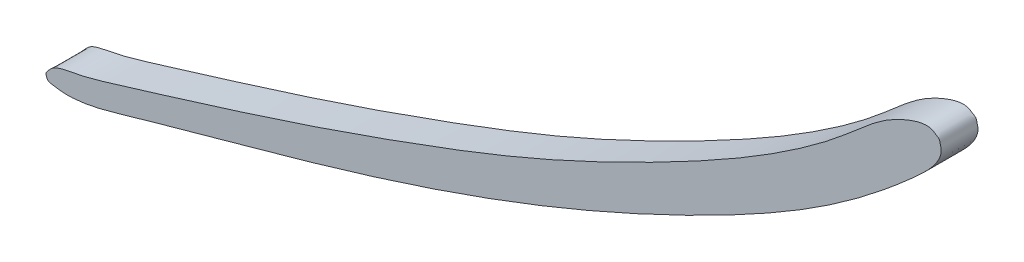
ISO-10303-21;
HEADER;
FILE_DESCRIPTION(('STEP AP214'),'2;1');
FILE_NAME('part.step','',(''),(''),'','','');
FILE_SCHEMA(('AUTOMOTIVE_DESIGN { 1 0 10303 214 1 1 1 1 }'));
ENDSEC;
DATA;
#1=APPLICATION_CONTEXT('core data for automotive mechanical design processes');
#2=APPLICATION_PROTOCOL_DEFINITION('international standard','automotive_design',2000,#1);
#3=PRODUCT_CONTEXT('',#1,'mechanical');
#4=PRODUCT('Part','Part','',(#3));
#5=PRODUCT_RELATED_PRODUCT_CATEGORY('part','',(#4));
#6=PRODUCT_DEFINITION_FORMATION('','',#4);
#7=PRODUCT_DEFINITION_CONTEXT('part definition',#1,'design');
#8=PRODUCT_DEFINITION('design','',#6,#7);
#9=PRODUCT_DEFINITION_SHAPE('','',#8);
#10=(LENGTH_UNIT() NAMED_UNIT(*) SI_UNIT(.MILLI.,.METRE.));
#11=(NAMED_UNIT(*) PLANE_ANGLE_UNIT() SI_UNIT($,.RADIAN.));
#12=(NAMED_UNIT(*) SI_UNIT($,.STERADIAN.) SOLID_ANGLE_UNIT());
#13=UNCERTAINTY_MEASURE_WITH_UNIT(LENGTH_MEASURE(1.E-05),#10,'distance_accuracy_value','');
#14=(GEOMETRIC_REPRESENTATION_CONTEXT(3) GLOBAL_UNCERTAINTY_ASSIGNED_CONTEXT((#13)) GLOBAL_UNIT_ASSIGNED_CONTEXT((#10,
#11,#12)) REPRESENTATION_CONTEXT('',''));
#15=CARTESIAN_POINT('',(0.,0.,0.));
#16=DIRECTION('',(0.,0.,1.));
#17=DIRECTION('',(1.,0.,0.));
#18=AXIS2_PLACEMENT_3D('',#15,#16,#17);
#19=CARTESIAN_POINT('',(100.357596998493,0.,180.));
#20=CARTESIAN_POINT('',(100.284564076697,0.123833385563883,180.));
#21=CARTESIAN_POINT('',(100.1718069959,0.212765581897581,180.));
#22=CARTESIAN_POINT('',(99.9399820362263,0.376152871961994,180.));
#23=CARTESIAN_POINT('',(99.8191458309457,0.450330944081236,180.));
#24=CARTESIAN_POINT('',(99.580794144756,0.603755840918532,180.));
#25=CARTESIAN_POINT('',(99.4630476931335,0.682650112014923,180.));
#26=CARTESIAN_POINT('',(99.2219774478867,0.831925401193218,180.));
#27=CARTESIAN_POINT('',(99.0988364588317,0.902352313442207,180.));
#28=CARTESIAN_POINT('',(98.8480318658965,1.03042654218533,180.));
#29=CARTESIAN_POINT('',(98.7200524653228,1.08812553435883,180.));
#30=CARTESIAN_POINT('',(98.4543143861107,1.17947239122632,180.));
#31=CARTESIAN_POINT('',(98.3157959849267,1.21364291149893,180.));
#32=CARTESIAN_POINT('',(97.8940312362554,1.284604974337,180.));
#33=CARTESIAN_POINT('',(97.6125513305541,1.28966980048311,180.));
#34=CARTESIAN_POINT('',(97.0492905270607,1.25789240665976,180.));
#35=CARTESIAN_POINT('',(96.7667547085918,1.2198796468729,180.));
#36=CARTESIAN_POINT('',(96.2114552105347,1.1231216715102,180.));
#37=CARTESIAN_POINT('',(95.9370866992994,1.06388696429744,180.));
#38=CARTESIAN_POINT('',(95.1227735219391,0.857094016878209,180.));
#39=CARTESIAN_POINT('',(94.5910699743376,0.682270678267837,180.));
#40=CARTESIAN_POINT('',(93.5381130064233,0.298050569292589,180.));
#41=CARTESIAN_POINT('',(93.0160958930631,0.0861587635782107,180.));
#42=CARTESIAN_POINT('',(91.9890518759685,-0.36915545719693,180.));
#43=CARTESIAN_POINT('',(91.4850001878203,-0.611317029161509,180.));
#44=CARTESIAN_POINT('',(89.9991104563554,-1.37802894930529,180.));
#45=CARTESIAN_POINT('',(89.0443736878787,-1.94408680547137,180.));
#46=CARTESIAN_POINT('',(86.2846250245858,-3.8022507239045,180.));
#47=CARTESIAN_POINT('',(84.5772379029974,-5.24411582128132,180.));
#48=CARTESIAN_POINT('',(82.0384156511056,-7.44008456564829,180.));
#49=CARTESIAN_POINT('',(81.1947684620828,-8.17601231523193,180.));
#50=CARTESIAN_POINT('',(79.4931062170155,-9.62632790616549,180.));
#51=CARTESIAN_POINT('',(78.6366228308067,-10.3430119845042,180.));
#52=CARTESIAN_POINT('',(76.0374957654299,-12.4485734230024,180.));
#53=CARTESIAN_POINT('',(74.2638453137555,-13.790966288741,180.));
#54=CARTESIAN_POINT('',(70.6621256552049,-16.3941689298775,180.));
#55=CARTESIAN_POINT('',(68.8343618200903,-17.6554365101613,180.));
#56=CARTESIAN_POINT('',(65.1383235479649,-20.117239298553,180.));
#57=CARTESIAN_POINT('',(63.269618837106,-21.317129452027,180.));
#58=CARTESIAN_POINT('',(59.4917611918747,-23.6562709027426,180.));
#59=CARTESIAN_POINT('',(57.5830072451456,-24.7961203512066,180.));
#60=CARTESIAN_POINT('',(53.7335218816293,-27.0278795108338,180.));
#61=CARTESIAN_POINT('',(51.7928720028525,-28.1199114615235,180.));
#62=CARTESIAN_POINT('',(47.8886090917874,-30.2695496392623,180.));
#63=CARTESIAN_POINT('',(45.9245375705397,-31.3272232535746,180.));
#64=CARTESIAN_POINT('',(40.0055826359343,-34.4550736421063,180.));
#65=CARTESIAN_POINT('',(36.0273013645076,-36.4787990170594,180.));
#66=CARTESIAN_POINT('',(28.0204531927224,-40.422208883102,180.));
#67=CARTESIAN_POINT('',(23.9933642202147,-42.343354980724,180.));
#68=CARTESIAN_POINT('',(15.8777385675345,-46.0543672510722,180.));
#69=CARTESIAN_POINT('',(11.7860383138545,-47.8406249377227,180.));
#70=CARTESIAN_POINT('',(3.54390757789736,-51.2624753378445,180.));
#71=CARTESIAN_POINT('',(-0.606732300133897,-52.8995267825835,180.));
#72=CARTESIAN_POINT('',(-8.94570307334646,-56.0794818070994,180.));
#73=CARTESIAN_POINT('',(-13.1326238483286,-57.6255151569218,180.));
#74=CARTESIAN_POINT('',(-21.5248732248059,-60.6630575336631,180.));
#75=CARTESIAN_POINT('',(-25.7309923379498,-62.1539991477899,180.));
#76=CARTESIAN_POINT('',(-34.1669983775842,-65.0697006664974,180.));
#77=CARTESIAN_POINT('',(-38.3967454095089,-66.492568338213,180.));
#78=CARTESIAN_POINT('',(-51.1190202933381,-70.6598332195802,180.));
#79=CARTESIAN_POINT('',(-59.6450368689311,-73.3026026299481,180.));
#80=CARTESIAN_POINT('',(-70.3053738609543,-76.5941943601111,180.));
#81=CARTESIAN_POINT('',(-72.4379757266771,-77.2507833852964,180.));
#82=CARTESIAN_POINT('',(-75.6391163829759,-78.2283636763549,180.));
#83=CARTESIAN_POINT('',(-76.7065611260427,-78.5529218901122,180.));
#84=CARTESIAN_POINT('',(-78.8423033017038,-79.1992059437037,180.));
#85=CARTESIAN_POINT('',(-79.9102743722744,-79.5220590013392,180.));
#86=CARTESIAN_POINT('',(-82.0485597230633,-80.1598424302449,180.));
#87=CARTESIAN_POINT('',(-83.1195914599967,-80.471627139042,180.));
#88=CARTESIAN_POINT('',(-85.2770764547014,-81.037177887814,180.));
#89=CARTESIAN_POINT('',(-86.3633544009948,-81.2918577195193,180.));
#90=CARTESIAN_POINT('',(-88.5561838536323,-81.7235926198972,180.));
#91=CARTESIAN_POINT('',(-89.665311081882,-81.8906433389046,180.));
#92=CARTESIAN_POINT('',(-91.0056619614809,-82.2763226778538,180.));
#93=CARTESIAN_POINT('',(-91.2713735087827,-82.362515813821,180.));
#94=CARTESIAN_POINT('',(-91.7937295058987,-82.5697202563305,180.));
#95=CARTESIAN_POINT('',(-92.0524856942449,-82.6915780343096,180.));
#96=CARTESIAN_POINT('',(-92.4223223007713,-82.9153921338796,180.));
#97=CARTESIAN_POINT('',(-92.5406553341932,-82.9957070849262,180.));
#98=CARTESIAN_POINT('',(-92.7659482294566,-83.1694679671328,180.));
#99=CARTESIAN_POINT('',(-92.8730879010213,-83.2627062976352,180.));
#100=CARTESIAN_POINT('',(-93.0804276444457,-83.4571951252624,180.));
#101=CARTESIAN_POINT('',(-93.1804592347762,-83.5586401439936,180.));
#102=CARTESIAN_POINT('',(-93.3735201377004,-83.7696147134676,180.));
#103=CARTESIAN_POINT('',(-93.4669594143682,-83.8787424348411,180.));
#104=CARTESIAN_POINT('',(-93.6535733926293,-84.0966690886267,180.));
#105=CARTESIAN_POINT('',(-93.745895418081,-84.2063735166704,180.));
#106=CARTESIAN_POINT('',(-93.9079918980542,-84.4427474965758,180.));
#107=CARTESIAN_POINT('',(-93.9765667432904,-84.5764537682781,180.));
#108=CARTESIAN_POINT('',(-93.9975405674465,-84.8685068828778,180.));
#109=CARTESIAN_POINT('',(-93.9599213117981,-85.0123469235009,180.));
#110=CARTESIAN_POINT('',(-93.864869588568,-85.2839045374195,180.));
#111=CARTESIAN_POINT('',(-93.8085372532467,-85.4161542451667,180.));
#112=CARTESIAN_POINT('',(-93.674310432252,-85.6720128618168,180.));
#113=CARTESIAN_POINT('',(-93.5940901304015,-85.7962114367292,180.));
#114=CARTESIAN_POINT('',(-93.4233910624318,-85.9323044035315,180.));
#115=CARTESIAN_POINT('',(-93.3608096430877,-85.968100814657,180.));
#116=CARTESIAN_POINT('',(-93.2239830330189,-86.0200520967881,180.));
#117=CARTESIAN_POINT('',(-93.1536636166531,-86.0360909248068,180.));
#118=CARTESIAN_POINT('',(-92.9414266176545,-86.074434430175,180.));
#119=CARTESIAN_POINT('',(-92.7978451994974,-86.0875183358381,180.));
#120=CARTESIAN_POINT('',(-92.5126129393918,-86.1252122606132,180.));
#121=CARTESIAN_POINT('',(-92.370723962876,-86.1482265251761,180.));
#122=CARTESIAN_POINT('',(-91.9452406398153,-86.2211056255292,180.));
#123=CARTESIAN_POINT('',(-91.6622725365127,-86.2767645916863,180.));
#124=CARTESIAN_POINT('',(-91.0947625716108,-86.371890643436,180.));
#125=CARTESIAN_POINT('',(-90.8099854369958,-86.4089370824941,180.));
#126=CARTESIAN_POINT('',(-89.9518364269166,-86.4807983070235,180.));
#127=CARTESIAN_POINT('',(-89.3741554483251,-86.4848438521231,180.));
#128=CARTESIAN_POINT('',(-87.643428602025,-86.4302366881349,180.));
#129=CARTESIAN_POINT('',(-86.5055194112804,-86.309722486645,180.));
#130=CARTESIAN_POINT('',(-84.2533478115465,-85.943673410727,180.));
#131=CARTESIAN_POINT('',(-83.1388402758916,-85.699434522408,180.));
#132=CARTESIAN_POINT('',(-80.9198834121042,-85.1577789439862,180.));
#133=CARTESIAN_POINT('',(-79.81553900559,-84.8598075326758,180.));
#134=CARTESIAN_POINT('',(-77.6108896280681,-84.2425081909942,180.));
#135=CARTESIAN_POINT('',(-76.5108878061365,-83.924720957884,180.));
#136=CARTESIAN_POINT('',(-73.2128947572394,-82.9659215655104,180.));
#137=CARTESIAN_POINT('',(-71.0148379297019,-82.3246254365207,180.));
#138=CARTESIAN_POINT('',(-64.4099313812657,-80.4379904574159,180.));
#139=CARTESIAN_POINT('',(-59.9944958118596,-79.2233458783901,180.));
#140=CARTESIAN_POINT('',(-51.1621206758862,-76.8001772514212,180.));
#141=CARTESIAN_POINT('',(-46.7464106845232,-75.5868409707097,180.));
#142=CARTESIAN_POINT('',(-33.5248883900532,-71.8563597118607,180.));
#143=CARTESIAN_POINT('',(-24.7447016577955,-69.2460652672958,180.));
#144=CARTESIAN_POINT('',(-11.6761479943598,-65.0111244996579,180.));
#145=CARTESIAN_POINT('',(-7.33646538959087,-63.5474150177365,180.));
#146=CARTESIAN_POINT('',(1.29645164650859,-60.5044810443304,180.));
#147=CARTESIAN_POINT('',(5.59078015391663,-58.9249825920769,180.));
#148=CARTESIAN_POINT('',(14.128577161246,-55.6326156309472,180.));
#149=CARTESIAN_POINT('',(18.371600560433,-53.9185799356498,180.));
#150=CARTESIAN_POINT('',(26.8060347153991,-50.3551648533416,180.));
#151=CARTESIAN_POINT('',(30.99810065882,-48.5064193893053,180.));
#152=CARTESIAN_POINT('',(39.3246823519063,-44.6878136441175,180.));
#153=CARTESIAN_POINT('',(43.4583051115732,-42.7176638277545,180.));
#154=CARTESIAN_POINT('',(51.6526324636003,-38.6471262315989,180.));
#155=CARTESIAN_POINT('',(55.7145255326378,-36.5464383014973,180.));
#156=CARTESIAN_POINT('',(63.7372602318084,-32.1576344952031,180.));
#157=CARTESIAN_POINT('',(67.6975077517729,-29.8684166767737,180.));
#158=CARTESIAN_POINT('',(73.5189033952594,-26.213916602779,180.));
#159=CARTESIAN_POINT('',(75.4410270013869,-24.9583497955172,180.));
#160=CARTESIAN_POINT('',(79.2271350098415,-22.368931413789,180.));
#161=CARTESIAN_POINT('',(81.0922287936191,-21.0347389727545,180.));
#162=CARTESIAN_POINT('',(86.6017634340861,-16.9110768090462,180.));
#163=CARTESIAN_POINT('',(90.1532331563606,-13.9992131379955,180.));
#164=CARTESIAN_POINT('',(94.4591958558904,-10.2095894224069,180.));
#165=CARTESIAN_POINT('',(95.3140472193599,-9.44409485902101,180.));
#166=CARTESIAN_POINT('',(96.571765941905,-8.2699100432364,180.));
#167=CARTESIAN_POINT('',(96.9859359342873,-7.87293788175203,180.));
#168=CARTESIAN_POINT('',(97.7957466211142,-7.0598329431514,180.));
#169=CARTESIAN_POINT('',(98.1916017580585,-6.6456481037435,180.));
#170=CARTESIAN_POINT('',(98.9439087026722,-5.78404815625674,180.));
#171=CARTESIAN_POINT('',(99.3002468321912,-5.33653717923619,180.));
#172=CARTESIAN_POINT('',(99.7823720088965,-4.62109504252404,180.));
#173=CARTESIAN_POINT('',(99.9338928046393,-4.3750601416664,180.));
#174=CARTESIAN_POINT('',(100.207907049516,-3.87059867837678,180.));
#175=CARTESIAN_POINT('',(100.330659509325,-3.6112420334724,180.));
#176=CARTESIAN_POINT('',(100.54409466435,-3.07649705166983,180.));
#177=CARTESIAN_POINT('',(100.634640168202,-2.80149047546065,180.));
#178=CARTESIAN_POINT('',(100.725097834817,-2.38099356471292,180.));
#179=CARTESIAN_POINT('',(100.747702064418,-2.23912560573565,180.));
#180=CARTESIAN_POINT('',(100.772736654833,-1.95084001382928,180.));
#181=CARTESIAN_POINT('',(100.775124179937,-1.80623786526604,180.));
#182=CARTESIAN_POINT('',(100.740515327152,-1.38077502056338,180.));
#183=CARTESIAN_POINT('',(100.661027039367,-1.10514880142835,180.));
#184=CARTESIAN_POINT('',(100.548101292082,-0.690481149006436,180.));
#185=CARTESIAN_POINT('',(100.51634211321,-0.550639413869628,180.));
#186=CARTESIAN_POINT('',(100.471354266735,-0.340147162503749,180.));
#187=CARTESIAN_POINT('',(100.456992786853,-0.269808445345127,180.));
#188=CARTESIAN_POINT('',(100.42858864016,-0.166189069486913,180.));
#189=CARTESIAN_POINT('',(100.41784219094,-0.132001148748352,180.));
#190=CARTESIAN_POINT('',(100.39176488452,-0.0648871351746971,180.));
#191=CARTESIAN_POINT('',(100.375855228942,-0.0309583463909664,180.));
#192=CARTESIAN_POINT('',(100.357596998493,0.,180.));
#193=B_SPLINE_CURVE_WITH_KNOTS('',3,(#19,#20,#21,#22,#23,#24,#25,#26,#27,#28,#29,#30,#31,#32,
#33,#34,#35,#36,#37,#38,#39,#40,#41,#42,#43,#44,#45,#46,#47,#48,#49,#50,#51,#52,#53,#54,#55,#56,
#57,#58,#59,#60,#61,#62,#63,#64,#65,#66,#67,#68,#69,#70,#71,#72,#73,#74,#75,#76,#77,#78,#79,#80,
#81,#82,#83,#84,#85,#86,#87,#88,#89,#90,#91,#92,#93,#94,#95,#96,#97,#98,#99,#100,#101,#102,#103,
#104,#105,#106,#107,#108,#109,#110,#111,#112,#113,#114,#115,#116,#117,#118,#119,#120,#121,#122,
#123,#124,#125,#126,#127,#128,#129,#130,#131,#132,#133,#134,#135,#136,#137,#138,#139,#140,#141,
#142,#143,#144,#145,#146,#147,#148,#149,#150,#151,#152,#153,#154,#155,#156,#157,#158,#159,#160,
#161,#162,#163,#164,#165,#166,#167,#168,#169,#170,#171,#172,#173,#174,#175,#176,#177,#178,#179,
#180,#181,#182,#183,#184,#185,#186,#187,#188,#189,#190,#191,#192),.UNSPECIFIED.,.T.,.F.,(4,2,2,
2,2,2,2,2,2,2,2,2,2,2,2,2,2,2,2,2,2,2,2,2,2,2,2,2,2,2,2,2,2,2,2,2,2,2,2,2,2,2,2,2,2,2,2,2,2,2,2,
2,2,2,2,2,2,2,2,2,2,2,2,2,2,2,2,2,2,2,2,2,2,2,2,2,2,2,2,2,2,2,2,2,2,2,4),(0.,
0.000976562500000093,0.00195312500000019,0.00292968750000028,0.00390625000000037,
0.00488281250000046,0.00585937500000056,0.00781250000000065,0.00976562500000074,
0.0117187500000008,0.0156250000000009,0.019531250000001,0.0234375000000011,0.0312500000000012,
0.0468750000000015,0.0546875000000016,0.0625000000000017,0.0781250000000019,0.0937500000000021,
0.109375000000002,0.125000000000002,0.140625000000003,0.156250000000003,0.187500000000003,
0.218750000000004,0.250000000000004,0.281250000000004,0.312500000000005,0.343750000000005,
0.375000000000006,0.437500000000006,0.453125000000007,0.460937500000007,0.468750000000007,
0.476562500000007,0.484375000000007,0.492187500000007,0.494140625000007,0.496093750000007,
0.497070312500007,0.498046875000007,0.499023437500007,0.500000000000008,0.500976562500008,
0.501953125000008,0.502929687500008,0.503906250000008,0.504882812500008,0.505371093750008,
0.505859375000008,0.506835937500008,0.507812500000008,0.509765625000008,0.511718750000008,
0.515625000000008,0.523437500000008,0.531250000000008,0.539062500000007,0.546875000000007,
0.562500000000007,0.593750000000007,0.625000000000006,0.687500000000005,0.718750000000005,
0.750000000000004,0.781250000000004,0.812500000000003,0.843750000000003,0.875000000000002,
0.906250000000002,0.921875000000002,0.937500000000001,0.968750000000001,0.976562500000001,
0.980468750000001,0.984375000000001,0.98828125,0.990234375,0.9921875,0.994140625,0.9951171875,
0.99609375,0.998046875,0.9990234375,0.99951171875,0.999755859375,1.),.UNSPECIFIED.);
#194=DIRECTION('',(0.,0.,-1.));
#195=VECTOR('',#194,1.);
#196=SURFACE_OF_LINEAR_EXTRUSION('',#193,#195);
#197=CARTESIAN_POINT('',(100.357596998493,0.,180.));
#198=CARTESIAN_POINT('',(100.375855228942,-0.0309583463909664,180.));
#199=CARTESIAN_POINT('',(100.39176488452,-0.0648871351746971,180.));
#200=CARTESIAN_POINT('',(100.41784219094,-0.132001148748352,180.));
#201=CARTESIAN_POINT('',(100.42858864016,-0.166189069486913,180.));
#202=CARTESIAN_POINT('',(100.456992786853,-0.269808445345127,180.));
#203=CARTESIAN_POINT('',(100.471354266735,-0.340147162503749,180.));
#204=CARTESIAN_POINT('',(100.51634211321,-0.550639413869628,180.));
#205=CARTESIAN_POINT('',(100.548101292082,-0.690481149006436,180.));
#206=CARTESIAN_POINT('',(100.661027039367,-1.10514880142835,180.));
#207=CARTESIAN_POINT('',(100.740515327152,-1.38077502056338,180.));
#208=CARTESIAN_POINT('',(100.775124179937,-1.80623786526604,180.));
#209=CARTESIAN_POINT('',(100.772736654833,-1.95084001382928,180.));
#210=CARTESIAN_POINT('',(100.747702064418,-2.23912560573565,180.));
#211=CARTESIAN_POINT('',(100.725097834817,-2.38099356471292,180.));
#212=CARTESIAN_POINT('',(100.634640168202,-2.80149047546065,180.));
#213=CARTESIAN_POINT('',(100.54409466435,-3.07649705166983,180.));
#214=CARTESIAN_POINT('',(100.330659509325,-3.6112420334724,180.));
#215=CARTESIAN_POINT('',(100.207907049516,-3.87059867837678,180.));
#216=CARTESIAN_POINT('',(99.9338928046393,-4.3750601416664,180.));
#217=CARTESIAN_POINT('',(99.7823720088965,-4.62109504252404,180.));
#218=CARTESIAN_POINT('',(99.3002468321912,-5.33653717923619,180.));
#219=CARTESIAN_POINT('',(98.9439087026722,-5.78404815625674,180.));
#220=CARTESIAN_POINT('',(98.1916017580585,-6.6456481037435,180.));
#221=CARTESIAN_POINT('',(97.7957466211142,-7.0598329431514,180.));
#222=CARTESIAN_POINT('',(96.9859359342873,-7.87293788175203,180.));
#223=CARTESIAN_POINT('',(96.571765941905,-8.2699100432364,180.));
#224=CARTESIAN_POINT('',(95.3140472193599,-9.44409485902101,180.));
#225=CARTESIAN_POINT('',(94.4591958558904,-10.2095894224069,180.));
#226=CARTESIAN_POINT('',(90.1532331563606,-13.9992131379955,180.));
#227=CARTESIAN_POINT('',(86.6017634340861,-16.9110768090462,180.));
#228=CARTESIAN_POINT('',(81.0922287936191,-21.0347389727545,180.));
#229=CARTESIAN_POINT('',(79.2271350098415,-22.368931413789,180.));
#230=CARTESIAN_POINT('',(75.4410270013869,-24.9583497955172,180.));
#231=CARTESIAN_POINT('',(73.5189033952594,-26.213916602779,180.));
#232=CARTESIAN_POINT('',(67.6975077517729,-29.8684166767737,180.));
#233=CARTESIAN_POINT('',(63.7372602318084,-32.1576344952031,180.));
#234=CARTESIAN_POINT('',(55.7145255326378,-36.5464383014973,180.));
#235=CARTESIAN_POINT('',(51.6526324636003,-38.6471262315989,180.));
#236=CARTESIAN_POINT('',(43.4583051115732,-42.7176638277545,180.));
#237=CARTESIAN_POINT('',(39.3246823519063,-44.6878136441175,180.));
#238=CARTESIAN_POINT('',(30.99810065882,-48.5064193893053,180.));
#239=CARTESIAN_POINT('',(26.8060347153991,-50.3551648533416,180.));
#240=CARTESIAN_POINT('',(18.371600560433,-53.9185799356498,180.));
#241=CARTESIAN_POINT('',(14.128577161246,-55.6326156309472,180.));
#242=CARTESIAN_POINT('',(5.59078015391663,-58.9249825920769,180.));
#243=CARTESIAN_POINT('',(1.29645164650859,-60.5044810443304,180.));
#244=CARTESIAN_POINT('',(-7.33646538959087,-63.5474150177365,180.));
#245=CARTESIAN_POINT('',(-11.6761479943598,-65.0111244996579,180.));
#246=CARTESIAN_POINT('',(-24.7447016577955,-69.2460652672958,180.));
#247=CARTESIAN_POINT('',(-33.5248883900532,-71.8563597118607,180.));
#248=CARTESIAN_POINT('',(-46.7464106845232,-75.5868409707097,180.));
#249=CARTESIAN_POINT('',(-51.1621206758862,-76.8001772514212,180.));
#250=CARTESIAN_POINT('',(-59.9944958118596,-79.2233458783901,180.));
#251=CARTESIAN_POINT('',(-64.4099313812657,-80.4379904574159,180.));
#252=CARTESIAN_POINT('',(-71.0148379297019,-82.3246254365207,180.));
#253=CARTESIAN_POINT('',(-73.2128947572394,-82.9659215655104,180.));
#254=CARTESIAN_POINT('',(-76.5108878061365,-83.924720957884,180.));
#255=CARTESIAN_POINT('',(-77.6108896280681,-84.2425081909942,180.));
#256=CARTESIAN_POINT('',(-79.81553900559,-84.8598075326758,180.));
#257=CARTESIAN_POINT('',(-80.9198834121042,-85.1577789439862,180.));
#258=CARTESIAN_POINT('',(-83.1388402758916,-85.699434522408,180.));
#259=CARTESIAN_POINT('',(-84.2533478115465,-85.943673410727,180.));
#260=CARTESIAN_POINT('',(-86.5055194112804,-86.309722486645,180.));
#261=CARTESIAN_POINT('',(-87.643428602025,-86.4302366881349,180.));
#262=CARTESIAN_POINT('',(-89.3741554483251,-86.4848438521231,180.));
#263=CARTESIAN_POINT('',(-89.9518364269166,-86.4807983070235,180.));
#264=CARTESIAN_POINT('',(-90.8099854369958,-86.4089370824941,180.));
#265=CARTESIAN_POINT('',(-91.0947625716108,-86.371890643436,180.));
#266=CARTESIAN_POINT('',(-91.6622725365127,-86.2767645916863,180.));
#267=CARTESIAN_POINT('',(-91.9452406398153,-86.2211056255292,180.));
#268=CARTESIAN_POINT('',(-92.370723962876,-86.1482265251761,180.));
#269=CARTESIAN_POINT('',(-92.5126129393918,-86.1252122606132,180.));
#270=CARTESIAN_POINT('',(-92.7978451994974,-86.0875183358381,180.));
#271=CARTESIAN_POINT('',(-92.9414266176545,-86.074434430175,180.));
#272=CARTESIAN_POINT('',(-93.1536636166531,-86.0360909248068,180.));
#273=CARTESIAN_POINT('',(-93.2239830330189,-86.0200520967881,180.));
#274=CARTESIAN_POINT('',(-93.3608096430877,-85.968100814657,180.));
#275=CARTESIAN_POINT('',(-93.4233910624318,-85.9323044035315,180.));
#276=CARTESIAN_POINT('',(-93.5940901304015,-85.7962114367292,180.));
#277=CARTESIAN_POINT('',(-93.674310432252,-85.6720128618168,180.));
#278=CARTESIAN_POINT('',(-93.8085372532467,-85.4161542451667,180.));
#279=CARTESIAN_POINT('',(-93.864869588568,-85.2839045374195,180.));
#280=CARTESIAN_POINT('',(-93.9599213117981,-85.0123469235009,180.));
#281=CARTESIAN_POINT('',(-93.9975405674465,-84.8685068828778,180.));
#282=CARTESIAN_POINT('',(-93.9765667432904,-84.5764537682781,180.));
#283=CARTESIAN_POINT('',(-93.9079918980542,-84.4427474965758,180.));
#284=CARTESIAN_POINT('',(-93.745895418081,-84.2063735166704,180.));
#285=CARTESIAN_POINT('',(-93.6535733926293,-84.0966690886267,180.));
#286=CARTESIAN_POINT('',(-93.4669594143682,-83.8787424348411,180.));
#287=CARTESIAN_POINT('',(-93.3735201377004,-83.7696147134676,180.));
#288=CARTESIAN_POINT('',(-93.1804592347762,-83.5586401439936,180.));
#289=CARTESIAN_POINT('',(-93.0804276444457,-83.4571951252624,180.));
#290=CARTESIAN_POINT('',(-92.8730879010213,-83.2627062976352,180.));
#291=CARTESIAN_POINT('',(-92.7659482294566,-83.1694679671328,180.));
#292=CARTESIAN_POINT('',(-92.5406553341932,-82.9957070849262,180.));
#293=CARTESIAN_POINT('',(-92.4223223007713,-82.9153921338796,180.));
#294=CARTESIAN_POINT('',(-92.0524856942449,-82.6915780343096,180.));
#295=CARTESIAN_POINT('',(-91.7937295058987,-82.5697202563305,180.));
#296=CARTESIAN_POINT('',(-91.2713735087827,-82.362515813821,180.));
#297=CARTESIAN_POINT('',(-91.0056619614809,-82.2763226778538,180.));
#298=CARTESIAN_POINT('',(-89.665311081882,-81.8906433389046,180.));
#299=CARTESIAN_POINT('',(-88.5561838536323,-81.7235926198972,180.));
#300=CARTESIAN_POINT('',(-86.3633544009948,-81.2918577195193,180.));
#301=CARTESIAN_POINT('',(-85.2770764547014,-81.037177887814,180.));
#302=CARTESIAN_POINT('',(-83.1195914599967,-80.471627139042,180.));
#303=CARTESIAN_POINT('',(-82.0485597230633,-80.1598424302449,180.));
#304=CARTESIAN_POINT('',(-79.9102743722744,-79.5220590013392,180.));
#305=CARTESIAN_POINT('',(-78.8423033017038,-79.1992059437037,180.));
#306=CARTESIAN_POINT('',(-76.7065611260427,-78.5529218901122,180.));
#307=CARTESIAN_POINT('',(-75.6391163829759,-78.2283636763549,180.));
#308=CARTESIAN_POINT('',(-72.4379757266771,-77.2507833852964,180.));
#309=CARTESIAN_POINT('',(-70.3053738609543,-76.5941943601111,180.));
#310=CARTESIAN_POINT('',(-59.6450368689311,-73.3026026299481,180.));
#311=CARTESIAN_POINT('',(-51.1190202933381,-70.6598332195802,180.));
#312=CARTESIAN_POINT('',(-38.3967454095089,-66.492568338213,180.));
#313=CARTESIAN_POINT('',(-34.1669983775842,-65.0697006664974,180.));
#314=CARTESIAN_POINT('',(-25.7309923379498,-62.1539991477899,180.));
#315=CARTESIAN_POINT('',(-21.5248732248059,-60.6630575336631,180.));
#316=CARTESIAN_POINT('',(-13.1326238483286,-57.6255151569218,180.));
#317=CARTESIAN_POINT('',(-8.94570307334646,-56.0794818070994,180.));
#318=CARTESIAN_POINT('',(-0.606732300133897,-52.8995267825835,180.));
#319=CARTESIAN_POINT('',(3.54390757789736,-51.2624753378445,180.));
#320=CARTESIAN_POINT('',(11.7860383138545,-47.8406249377227,180.));
#321=CARTESIAN_POINT('',(15.8777385675345,-46.0543672510722,180.));
#322=CARTESIAN_POINT('',(23.9933642202147,-42.343354980724,180.));
#323=CARTESIAN_POINT('',(28.0204531927224,-40.422208883102,180.));
#324=CARTESIAN_POINT('',(36.0273013645076,-36.4787990170594,180.));
#325=CARTESIAN_POINT('',(40.0055826359343,-34.4550736421063,180.));
#326=CARTESIAN_POINT('',(45.9245375705397,-31.3272232535746,180.));
#327=CARTESIAN_POINT('',(47.8886090917874,-30.2695496392623,180.));
#328=CARTESIAN_POINT('',(51.7928720028525,-28.1199114615235,180.));
#329=CARTESIAN_POINT('',(53.7335218816293,-27.0278795108338,180.));
#330=CARTESIAN_POINT('',(57.5830072451456,-24.7961203512066,180.));
#331=CARTESIAN_POINT('',(59.4917611918747,-23.6562709027426,180.));
#332=CARTESIAN_POINT('',(63.269618837106,-21.317129452027,180.));
#333=CARTESIAN_POINT('',(65.1383235479649,-20.117239298553,180.));
#334=CARTESIAN_POINT('',(68.8343618200903,-17.6554365101613,180.));
#335=CARTESIAN_POINT('',(70.6621256552049,-16.3941689298775,180.));
#336=CARTESIAN_POINT('',(74.2638453137555,-13.790966288741,180.));
#337=CARTESIAN_POINT('',(76.0374957654299,-12.4485734230024,180.));
#338=CARTESIAN_POINT('',(78.6366228308067,-10.3430119845042,180.));
#339=CARTESIAN_POINT('',(79.4931062170155,-9.62632790616549,180.));
#340=CARTESIAN_POINT('',(81.1947684620828,-8.17601231523193,180.));
#341=CARTESIAN_POINT('',(82.0384156511056,-7.44008456564829,180.));
#342=CARTESIAN_POINT('',(84.5772379029974,-5.24411582128132,180.));
#343=CARTESIAN_POINT('',(86.2846250245858,-3.8022507239045,180.));
#344=CARTESIAN_POINT('',(89.0443736878787,-1.94408680547137,180.));
#345=CARTESIAN_POINT('',(89.9991104563554,-1.37802894930529,180.));
#346=CARTESIAN_POINT('',(91.4850001878203,-0.611317029161509,180.));
#347=CARTESIAN_POINT('',(91.9890518759685,-0.36915545719693,180.));
#348=CARTESIAN_POINT('',(93.0160958930631,0.0861587635782107,180.));
#349=CARTESIAN_POINT('',(93.5381130064233,0.298050569292589,180.));
#350=CARTESIAN_POINT('',(94.5910699743376,0.682270678267837,180.));
#351=CARTESIAN_POINT('',(95.1227735219391,0.857094016878209,180.));
#352=CARTESIAN_POINT('',(95.9370866992994,1.06388696429744,180.));
#353=CARTESIAN_POINT('',(96.2114552105347,1.1231216715102,180.));
#354=CARTESIAN_POINT('',(96.7667547085918,1.2198796468729,180.));
#355=CARTESIAN_POINT('',(97.0492905270607,1.25789240665976,180.));
#356=CARTESIAN_POINT('',(97.6125513305541,1.28966980048311,180.));
#357=CARTESIAN_POINT('',(97.8940312362554,1.284604974337,180.));
#358=CARTESIAN_POINT('',(98.3157959849267,1.21364291149893,180.));
#359=CARTESIAN_POINT('',(98.4543143861107,1.17947239122632,180.));
#360=CARTESIAN_POINT('',(98.7200524653228,1.08812553435883,180.));
#361=CARTESIAN_POINT('',(98.8480318658965,1.03042654218533,180.));
#362=CARTESIAN_POINT('',(99.0988364588317,0.902352313442207,180.));
#363=CARTESIAN_POINT('',(99.2219774478867,0.831925401193218,180.));
#364=CARTESIAN_POINT('',(99.4630476931335,0.682650112014923,180.));
#365=CARTESIAN_POINT('',(99.580794144756,0.603755840918532,180.));
#366=CARTESIAN_POINT('',(99.8191458309457,0.450330944081236,180.));
#367=CARTESIAN_POINT('',(99.9399820362263,0.376152871961994,180.));
#368=CARTESIAN_POINT('',(100.1718069959,0.212765581897581,180.));
#369=CARTESIAN_POINT('',(100.284564076697,0.123833385563883,180.));
#370=CARTESIAN_POINT('',(100.357596998493,0.,180.));
#371=B_SPLINE_CURVE_WITH_KNOTS('',3,(#197,#198,#199,#200,#201,#202,#203,#204,#205,#206,#207,
#208,#209,#210,#211,#212,#213,#214,#215,#216,#217,#218,#219,#220,#221,#222,#223,#224,#225,#226,
#227,#228,#229,#230,#231,#232,#233,#234,#235,#236,#237,#238,#239,#240,#241,#242,#243,#244,#245,
#246,#247,#248,#249,#250,#251,#252,#253,#254,#255,#256,#257,#258,#259,#260,#261,#262,#263,#264,
#265,#266,#267,#268,#269,#270,#271,#272,#273,#274,#275,#276,#277,#278,#279,#280,#281,#282,#283,
#284,#285,#286,#287,#288,#289,#290,#291,#292,#293,#294,#295,#296,#297,#298,#299,#300,#301,#302,
#303,#304,#305,#306,#307,#308,#309,#310,#311,#312,#313,#314,#315,#316,#317,#318,#319,#320,#321,
#322,#323,#324,#325,#326,#327,#328,#329,#330,#331,#332,#333,#334,#335,#336,#337,#338,#339,#340,
#341,#342,#343,#344,#345,#346,#347,#348,#349,#350,#351,#352,#353,#354,#355,#356,#357,#358,#359,
#360,#361,#362,#363,#364,#365,#366,#367,#368,#369,#370),.UNSPECIFIED.,.T.,.F.,(4,2,2,2,2,2,2,2,
2,2,2,2,2,2,2,2,2,2,2,2,2,2,2,2,2,2,2,2,2,2,2,2,2,2,2,2,2,2,2,2,2,2,2,2,2,2,2,2,2,2,2,2,2,2,2,2,
2,2,2,2,2,2,2,2,2,2,2,2,2,2,2,2,2,2,2,2,2,2,2,2,2,2,2,2,2,2,4),(0.,0.000244140624999889,
0.000488281249999889,0.000976562499999889,0.00195312499999989,0.00390624999999967,
0.00488281249999967,0.00585937499999967,0.00781249999999967,0.00976562499999956,
0.0117187499999996,0.0156249999999994,0.0195312499999994,0.0234374999999993,0.0312499999999992,
0.0624999999999986,0.0781249999999984,0.0937499999999982,0.124999999999998,0.156249999999997,
0.187499999999997,0.218749999999996,0.249999999999996,0.281249999999995,0.312499999999995,
0.374999999999994,0.406249999999993,0.437499999999993,0.453124999999993,0.460937499999993,
0.468749999999992,0.476562499999992,0.484374999999992,0.488281249999992,0.490234374999992,
0.492187499999992,0.493164062499992,0.494140624999992,0.494628906249992,0.495117187499992,
0.496093749999992,0.497070312499992,0.498046874999992,0.499023437499992,0.499999999999992,
0.500976562499992,0.501953124999993,0.502929687499993,0.503906249999993,0.505859374999993,
0.507812499999993,0.515624999999993,0.523437499999993,0.531249999999993,0.539062499999993,
0.546874999999993,0.562499999999994,0.624999999999994,0.656249999999995,0.687499999999995,
0.718749999999996,0.749999999999996,0.781249999999996,0.812499999999997,0.843749999999997,
0.859374999999997,0.874999999999998,0.890624999999998,0.906249999999998,0.921874999999998,
0.937499999999998,0.945312499999998,0.953124999999999,0.968749999999999,0.976562499999999,
0.980468749999999,0.984374999999999,0.988281249999999,0.990234374999999,0.992187499999999,
0.994140624999999,0.9951171875,0.99609375,0.9970703125,0.998046875,0.9990234375,1.),.UNSPECIFIED.);
#372=CARTESIAN_POINT('',(100.357596998493,0.,180.));
#373=VERTEX_POINT('',#372);
#374=EDGE_CURVE('E10',#373,#373,#371,.F.);
#375=ORIENTED_EDGE('',*,*,#374,.F.);
#376=EDGE_LOOP('',(#375));
#377=FACE_BOUND('',#376,.T.);
#378=CARTESIAN_POINT('',(100.357596998493,0.,172.));
#379=CARTESIAN_POINT('',(100.284564076697,0.123833385563883,172.));
#380=CARTESIAN_POINT('',(100.1718069959,0.212765581897581,172.));
#381=CARTESIAN_POINT('',(99.9399820362263,0.376152871961994,172.));
#382=CARTESIAN_POINT('',(99.8191458309457,0.450330944081236,172.));
#383=CARTESIAN_POINT('',(99.580794144756,0.603755840918532,172.));
#384=CARTESIAN_POINT('',(99.4630476931335,0.682650112014923,172.));
#385=CARTESIAN_POINT('',(99.2219774478867,0.831925401193218,172.));
#386=CARTESIAN_POINT('',(99.0988364588317,0.902352313442207,172.));
#387=CARTESIAN_POINT('',(98.8480318658965,1.03042654218533,172.));
#388=CARTESIAN_POINT('',(98.7200524653228,1.08812553435883,172.));
#389=CARTESIAN_POINT('',(98.4543143861107,1.17947239122632,172.));
#390=CARTESIAN_POINT('',(98.3157959849267,1.21364291149893,172.));
#391=CARTESIAN_POINT('',(97.8940312362554,1.284604974337,172.));
#392=CARTESIAN_POINT('',(97.6125513305541,1.28966980048311,172.));
#393=CARTESIAN_POINT('',(97.0492905270607,1.25789240665976,172.));
#394=CARTESIAN_POINT('',(96.7667547085918,1.2198796468729,172.));
#395=CARTESIAN_POINT('',(96.2114552105347,1.1231216715102,172.));
#396=CARTESIAN_POINT('',(95.9370866992994,1.06388696429744,172.));
#397=CARTESIAN_POINT('',(95.1227735219391,0.857094016878209,172.));
#398=CARTESIAN_POINT('',(94.5910699743376,0.682270678267837,172.));
#399=CARTESIAN_POINT('',(93.5381130064233,0.298050569292589,172.));
#400=CARTESIAN_POINT('',(93.0160958930631,0.0861587635782107,172.));
#401=CARTESIAN_POINT('',(91.9890518759685,-0.36915545719693,172.));
#402=CARTESIAN_POINT('',(91.4850001878203,-0.611317029161509,172.));
#403=CARTESIAN_POINT('',(89.9991104563554,-1.37802894930529,172.));
#404=CARTESIAN_POINT('',(89.0443736878787,-1.94408680547137,172.));
#405=CARTESIAN_POINT('',(86.2846250245858,-3.8022507239045,172.));
#406=CARTESIAN_POINT('',(84.5772379029974,-5.24411582128132,172.));
#407=CARTESIAN_POINT('',(82.0384156511056,-7.44008456564829,172.));
#408=CARTESIAN_POINT('',(81.1947684620828,-8.17601231523193,172.));
#409=CARTESIAN_POINT('',(79.4931062170155,-9.62632790616549,172.));
#410=CARTESIAN_POINT('',(78.6366228308067,-10.3430119845042,172.));
#411=CARTESIAN_POINT('',(76.0374957654299,-12.4485734230024,172.));
#412=CARTESIAN_POINT('',(74.2638453137555,-13.790966288741,172.));
#413=CARTESIAN_POINT('',(70.6621256552049,-16.3941689298775,172.));
#414=CARTESIAN_POINT('',(68.8343618200903,-17.6554365101613,172.));
#415=CARTESIAN_POINT('',(65.1383235479649,-20.117239298553,172.));
#416=CARTESIAN_POINT('',(63.269618837106,-21.317129452027,172.));
#417=CARTESIAN_POINT('',(59.4917611918747,-23.6562709027426,172.));
#418=CARTESIAN_POINT('',(57.5830072451456,-24.7961203512066,172.));
#419=CARTESIAN_POINT('',(53.7335218816293,-27.0278795108338,172.));
#420=CARTESIAN_POINT('',(51.7928720028525,-28.1199114615235,172.));
#421=CARTESIAN_POINT('',(47.8886090917874,-30.2695496392623,172.));
#422=CARTESIAN_POINT('',(45.9245375705397,-31.3272232535746,172.));
#423=CARTESIAN_POINT('',(40.0055826359343,-34.4550736421063,172.));
#424=CARTESIAN_POINT('',(36.0273013645076,-36.4787990170594,172.));
#425=CARTESIAN_POINT('',(28.0204531927224,-40.422208883102,172.));
#426=CARTESIAN_POINT('',(23.9933642202147,-42.343354980724,172.));
#427=CARTESIAN_POINT('',(15.8777385675345,-46.0543672510722,172.));
#428=CARTESIAN_POINT('',(11.7860383138545,-47.8406249377227,172.));
#429=CARTESIAN_POINT('',(3.54390757789736,-51.2624753378445,172.));
#430=CARTESIAN_POINT('',(-0.606732300133897,-52.8995267825835,172.));
#431=CARTESIAN_POINT('',(-8.94570307334646,-56.0794818070994,172.));
#432=CARTESIAN_POINT('',(-13.1326238483286,-57.6255151569218,172.));
#433=CARTESIAN_POINT('',(-21.5248732248059,-60.6630575336631,172.));
#434=CARTESIAN_POINT('',(-25.7309923379498,-62.1539991477899,172.));
#435=CARTESIAN_POINT('',(-34.1669983775842,-65.0697006664974,172.));
#436=CARTESIAN_POINT('',(-38.3967454095089,-66.492568338213,172.));
#437=CARTESIAN_POINT('',(-51.1190202933381,-70.6598332195802,172.));
#438=CARTESIAN_POINT('',(-59.6450368689311,-73.3026026299481,172.));
#439=CARTESIAN_POINT('',(-70.3053738609543,-76.5941943601111,172.));
#440=CARTESIAN_POINT('',(-72.4379757266771,-77.2507833852964,172.));
#441=CARTESIAN_POINT('',(-75.6391163829759,-78.2283636763549,172.));
#442=CARTESIAN_POINT('',(-76.7065611260427,-78.5529218901122,172.));
#443=CARTESIAN_POINT('',(-78.8423033017038,-79.1992059437037,172.));
#444=CARTESIAN_POINT('',(-79.9102743722744,-79.5220590013392,172.));
#445=CARTESIAN_POINT('',(-82.0485597230633,-80.1598424302449,172.));
#446=CARTESIAN_POINT('',(-83.1195914599967,-80.471627139042,172.));
#447=CARTESIAN_POINT('',(-85.2770764547014,-81.037177887814,172.));
#448=CARTESIAN_POINT('',(-86.3633544009948,-81.2918577195193,172.));
#449=CARTESIAN_POINT('',(-88.5561838536323,-81.7235926198972,172.));
#450=CARTESIAN_POINT('',(-89.665311081882,-81.8906433389046,172.));
#451=CARTESIAN_POINT('',(-91.0056619614809,-82.2763226778538,172.));
#452=CARTESIAN_POINT('',(-91.2713735087827,-82.362515813821,172.));
#453=CARTESIAN_POINT('',(-91.7937295058987,-82.5697202563305,172.));
#454=CARTESIAN_POINT('',(-92.0524856942449,-82.6915780343096,172.));
#455=CARTESIAN_POINT('',(-92.4223223007713,-82.9153921338796,172.));
#456=CARTESIAN_POINT('',(-92.5406553341932,-82.9957070849262,172.));
#457=CARTESIAN_POINT('',(-92.7659482294566,-83.1694679671328,172.));
#458=CARTESIAN_POINT('',(-92.8730879010213,-83.2627062976352,172.));
#459=CARTESIAN_POINT('',(-93.0804276444457,-83.4571951252624,172.));
#460=CARTESIAN_POINT('',(-93.1804592347762,-83.5586401439936,172.));
#461=CARTESIAN_POINT('',(-93.3735201377004,-83.7696147134676,172.));
#462=CARTESIAN_POINT('',(-93.4669594143682,-83.8787424348411,172.));
#463=CARTESIAN_POINT('',(-93.6535733926293,-84.0966690886267,172.));
#464=CARTESIAN_POINT('',(-93.745895418081,-84.2063735166704,172.));
#465=CARTESIAN_POINT('',(-93.9079918980542,-84.4427474965758,172.));
#466=CARTESIAN_POINT('',(-93.9765667432904,-84.5764537682781,172.));
#467=CARTESIAN_POINT('',(-93.9975405674465,-84.8685068828778,172.));
#468=CARTESIAN_POINT('',(-93.9599213117981,-85.0123469235009,172.));
#469=CARTESIAN_POINT('',(-93.864869588568,-85.2839045374195,172.));
#470=CARTESIAN_POINT('',(-93.8085372532467,-85.4161542451667,172.));
#471=CARTESIAN_POINT('',(-93.674310432252,-85.6720128618168,172.));
#472=CARTESIAN_POINT('',(-93.5940901304015,-85.7962114367292,172.));
#473=CARTESIAN_POINT('',(-93.4233910624318,-85.9323044035315,172.));
#474=CARTESIAN_POINT('',(-93.3608096430877,-85.968100814657,172.));
#475=CARTESIAN_POINT('',(-93.2239830330189,-86.0200520967881,172.));
#476=CARTESIAN_POINT('',(-93.1536636166531,-86.0360909248068,172.));
#477=CARTESIAN_POINT('',(-92.9414266176545,-86.074434430175,172.));
#478=CARTESIAN_POINT('',(-92.7978451994974,-86.0875183358381,172.));
#479=CARTESIAN_POINT('',(-92.5126129393918,-86.1252122606132,172.));
#480=CARTESIAN_POINT('',(-92.370723962876,-86.1482265251761,172.));
#481=CARTESIAN_POINT('',(-91.9452406398153,-86.2211056255292,172.));
#482=CARTESIAN_POINT('',(-91.6622725365127,-86.2767645916863,172.));
#483=CARTESIAN_POINT('',(-91.0947625716108,-86.371890643436,172.));
#484=CARTESIAN_POINT('',(-90.8099854369958,-86.4089370824941,172.));
#485=CARTESIAN_POINT('',(-89.9518364269166,-86.4807983070235,172.));
#486=CARTESIAN_POINT('',(-89.3741554483251,-86.4848438521231,172.));
#487=CARTESIAN_POINT('',(-87.643428602025,-86.4302366881349,172.));
#488=CARTESIAN_POINT('',(-86.5055194112804,-86.309722486645,172.));
#489=CARTESIAN_POINT('',(-84.2533478115465,-85.943673410727,172.));
#490=CARTESIAN_POINT('',(-83.1388402758916,-85.699434522408,172.));
#491=CARTESIAN_POINT('',(-80.9198834121042,-85.1577789439862,172.));
#492=CARTESIAN_POINT('',(-79.81553900559,-84.8598075326758,172.));
#493=CARTESIAN_POINT('',(-77.6108896280681,-84.2425081909942,172.));
#494=CARTESIAN_POINT('',(-76.5108878061365,-83.924720957884,172.));
#495=CARTESIAN_POINT('',(-73.2128947572394,-82.9659215655104,172.));
#496=CARTESIAN_POINT('',(-71.0148379297019,-82.3246254365207,172.));
#497=CARTESIAN_POINT('',(-64.4099313812657,-80.4379904574159,172.));
#498=CARTESIAN_POINT('',(-59.9944958118596,-79.2233458783901,172.));
#499=CARTESIAN_POINT('',(-51.1621206758862,-76.8001772514212,172.));
#500=CARTESIAN_POINT('',(-46.7464106845232,-75.5868409707097,172.));
#501=CARTESIAN_POINT('',(-33.5248883900532,-71.8563597118607,172.));
#502=CARTESIAN_POINT('',(-24.7447016577955,-69.2460652672958,172.));
#503=CARTESIAN_POINT('',(-11.6761479943598,-65.0111244996579,172.));
#504=CARTESIAN_POINT('',(-7.33646538959087,-63.5474150177365,172.));
#505=CARTESIAN_POINT('',(1.29645164650859,-60.5044810443304,172.));
#506=CARTESIAN_POINT('',(5.59078015391663,-58.9249825920769,172.));
#507=CARTESIAN_POINT('',(14.128577161246,-55.6326156309472,172.));
#508=CARTESIAN_POINT('',(18.371600560433,-53.9185799356498,172.));
#509=CARTESIAN_POINT('',(26.8060347153991,-50.3551648533416,172.));
#510=CARTESIAN_POINT('',(30.99810065882,-48.5064193893053,172.));
#511=CARTESIAN_POINT('',(39.3246823519063,-44.6878136441175,172.));
#512=CARTESIAN_POINT('',(43.4583051115732,-42.7176638277545,172.));
#513=CARTESIAN_POINT('',(51.6526324636003,-38.6471262315989,172.));
#514=CARTESIAN_POINT('',(55.7145255326378,-36.5464383014973,172.));
#515=CARTESIAN_POINT('',(63.7372602318084,-32.1576344952031,172.));
#516=CARTESIAN_POINT('',(67.6975077517729,-29.8684166767737,172.));
#517=CARTESIAN_POINT('',(73.5189033952594,-26.213916602779,172.));
#518=CARTESIAN_POINT('',(75.4410270013869,-24.9583497955172,172.));
#519=CARTESIAN_POINT('',(79.2271350098415,-22.368931413789,172.));
#520=CARTESIAN_POINT('',(81.0922287936191,-21.0347389727545,172.));
#521=CARTESIAN_POINT('',(86.6017634340861,-16.9110768090462,172.));
#522=CARTESIAN_POINT('',(90.1532331563606,-13.9992131379955,172.));
#523=CARTESIAN_POINT('',(94.4591958558904,-10.2095894224069,172.));
#524=CARTESIAN_POINT('',(95.3140472193599,-9.44409485902101,172.));
#525=CARTESIAN_POINT('',(96.571765941905,-8.2699100432364,172.));
#526=CARTESIAN_POINT('',(96.9859359342873,-7.87293788175203,172.));
#527=CARTESIAN_POINT('',(97.7957466211142,-7.0598329431514,172.));
#528=CARTESIAN_POINT('',(98.1916017580585,-6.6456481037435,172.));
#529=CARTESIAN_POINT('',(98.9439087026722,-5.78404815625674,172.));
#530=CARTESIAN_POINT('',(99.3002468321912,-5.33653717923619,172.));
#531=CARTESIAN_POINT('',(99.7823720088965,-4.62109504252404,172.));
#532=CARTESIAN_POINT('',(99.9338928046393,-4.3750601416664,172.));
#533=CARTESIAN_POINT('',(100.207907049516,-3.87059867837678,172.));
#534=CARTESIAN_POINT('',(100.330659509325,-3.6112420334724,172.));
#535=CARTESIAN_POINT('',(100.54409466435,-3.07649705166983,172.));
#536=CARTESIAN_POINT('',(100.634640168202,-2.80149047546065,172.));
#537=CARTESIAN_POINT('',(100.725097834817,-2.38099356471292,172.));
#538=CARTESIAN_POINT('',(100.747702064418,-2.23912560573565,172.));
#539=CARTESIAN_POINT('',(100.772736654833,-1.95084001382928,172.));
#540=CARTESIAN_POINT('',(100.775124179937,-1.80623786526604,172.));
#541=CARTESIAN_POINT('',(100.740515327152,-1.38077502056338,172.));
#542=CARTESIAN_POINT('',(100.661027039367,-1.10514880142835,172.));
#543=CARTESIAN_POINT('',(100.548101292082,-0.690481149006436,172.));
#544=CARTESIAN_POINT('',(100.51634211321,-0.550639413869628,172.));
#545=CARTESIAN_POINT('',(100.471354266735,-0.340147162503749,172.));
#546=CARTESIAN_POINT('',(100.456992786853,-0.269808445345127,172.));
#547=CARTESIAN_POINT('',(100.42858864016,-0.166189069486913,172.));
#548=CARTESIAN_POINT('',(100.41784219094,-0.132001148748352,172.));
#549=CARTESIAN_POINT('',(100.39176488452,-0.0648871351746971,172.));
#550=CARTESIAN_POINT('',(100.375855228942,-0.0309583463909664,172.));
#551=CARTESIAN_POINT('',(100.357596998493,0.,172.));
#552=B_SPLINE_CURVE_WITH_KNOTS('',3,(#378,#379,#380,#381,#382,#383,#384,#385,#386,#387,#388,
#389,#390,#391,#392,#393,#394,#395,#396,#397,#398,#399,#400,#401,#402,#403,#404,#405,#406,#407,
#408,#409,#410,#411,#412,#413,#414,#415,#416,#417,#418,#419,#420,#421,#422,#423,#424,#425,#426,
#427,#428,#429,#430,#431,#432,#433,#434,#435,#436,#437,#438,#439,#440,#441,#442,#443,#444,#445,
#446,#447,#448,#449,#450,#451,#452,#453,#454,#455,#456,#457,#458,#459,#460,#461,#462,#463,#464,
#465,#466,#467,#468,#469,#470,#471,#472,#473,#474,#475,#476,#477,#478,#479,#480,#481,#482,#483,
#484,#485,#486,#487,#488,#489,#490,#491,#492,#493,#494,#495,#496,#497,#498,#499,#500,#501,#502,
#503,#504,#505,#506,#507,#508,#509,#510,#511,#512,#513,#514,#515,#516,#517,#518,#519,#520,#521,
#522,#523,#524,#525,#526,#527,#528,#529,#530,#531,#532,#533,#534,#535,#536,#537,#538,#539,#540,
#541,#542,#543,#544,#545,#546,#547,#548,#549,#550,#551),.UNSPECIFIED.,.T.,.F.,(4,2,2,2,2,2,2,2,
2,2,2,2,2,2,2,2,2,2,2,2,2,2,2,2,2,2,2,2,2,2,2,2,2,2,2,2,2,2,2,2,2,2,2,2,2,2,2,2,2,2,2,2,2,2,2,2,
2,2,2,2,2,2,2,2,2,2,2,2,2,2,2,2,2,2,2,2,2,2,2,2,2,2,2,2,2,2,4),(0.,0.000976562500000093,
0.00195312500000019,0.00292968750000028,0.00390625000000037,0.00488281250000046,
0.00585937500000056,0.00781250000000065,0.00976562500000074,0.0117187500000008,
0.0156250000000009,0.019531250000001,0.0234375000000011,0.0312500000000012,0.0468750000000015,
0.0546875000000016,0.0625000000000017,0.0781250000000019,0.0937500000000021,0.109375000000002,
0.125000000000002,0.140625000000003,0.156250000000003,0.187500000000003,0.218750000000004,
0.250000000000004,0.281250000000004,0.312500000000005,0.343750000000005,0.375000000000006,
0.437500000000006,0.453125000000007,0.460937500000007,0.468750000000007,0.476562500000007,
0.484375000000007,0.492187500000007,0.494140625000007,0.496093750000007,0.497070312500007,
0.498046875000007,0.499023437500007,0.500000000000008,0.500976562500008,0.501953125000008,
0.502929687500008,0.503906250000008,0.504882812500008,0.505371093750008,0.505859375000008,
0.506835937500008,0.507812500000008,0.509765625000008,0.511718750000008,0.515625000000008,
0.523437500000008,0.531250000000008,0.539062500000007,0.546875000000007,0.562500000000007,
0.593750000000007,0.625000000000006,0.687500000000005,0.718750000000005,0.750000000000004,
0.781250000000004,0.812500000000003,0.843750000000003,0.875000000000002,0.906250000000002,
0.921875000000002,0.937500000000001,0.968750000000001,0.976562500000001,0.980468750000001,
0.984375000000001,0.98828125,0.990234375,0.9921875,0.994140625,0.9951171875,0.99609375,
0.998046875,0.9990234375,0.99951171875,0.999755859375,1.),.UNSPECIFIED.);
#553=CARTESIAN_POINT('',(100.357596998493,0.,172.));
#554=VERTEX_POINT('',#553);
#555=EDGE_CURVE('E38',#554,#554,#552,.T.);
#556=ORIENTED_EDGE('',*,*,#555,.T.);
#557=EDGE_LOOP('',(#556));
#558=FACE_BOUND('',#557,.T.);
#559=ADVANCED_FACE('F28',(#377,#558),#196,.F.);
#560=CARTESIAN_POINT('',(-93.5602664034966,-83.9877057617313,180.));
#561=DIRECTION('',(0.,0.,-1.));
#562=DIRECTION('',(-1.,0.,0.));
#563=AXIS2_PLACEMENT_3D('',#560,#561,#562);
#564=PLANE('',#563);
#565=ORIENTED_EDGE('',*,*,#374,.T.);
#566=EDGE_LOOP('',(#565));
#567=FACE_BOUND('',#566,.T.);
#568=ADVANCED_FACE('F69',(#567),#564,.F.);
#569=CARTESIAN_POINT('',(-93.5602664034966,-83.9877057617313,172.));
#570=DIRECTION('',(0.,0.,-1.));
#571=DIRECTION('',(-1.,0.,0.));
#572=AXIS2_PLACEMENT_3D('',#569,#570,#571);
#573=PLANE('',#572);
#574=ORIENTED_EDGE('',*,*,#555,.F.);
#575=EDGE_LOOP('',(#574));
#576=FACE_BOUND('',#575,.T.);
#577=ADVANCED_FACE('F77',(#576),#573,.T.);
#578=CLOSED_SHELL('',(#559,#568,#577));
#579=MANIFOLD_SOLID_BREP('B2',#578);
#580=ADVANCED_BREP_SHAPE_REPRESENTATION('',(#18,#579),#14);
#581=SHAPE_DEFINITION_REPRESENTATION(#9,#580);
ENDSEC;
END-ISO-10303-21;
